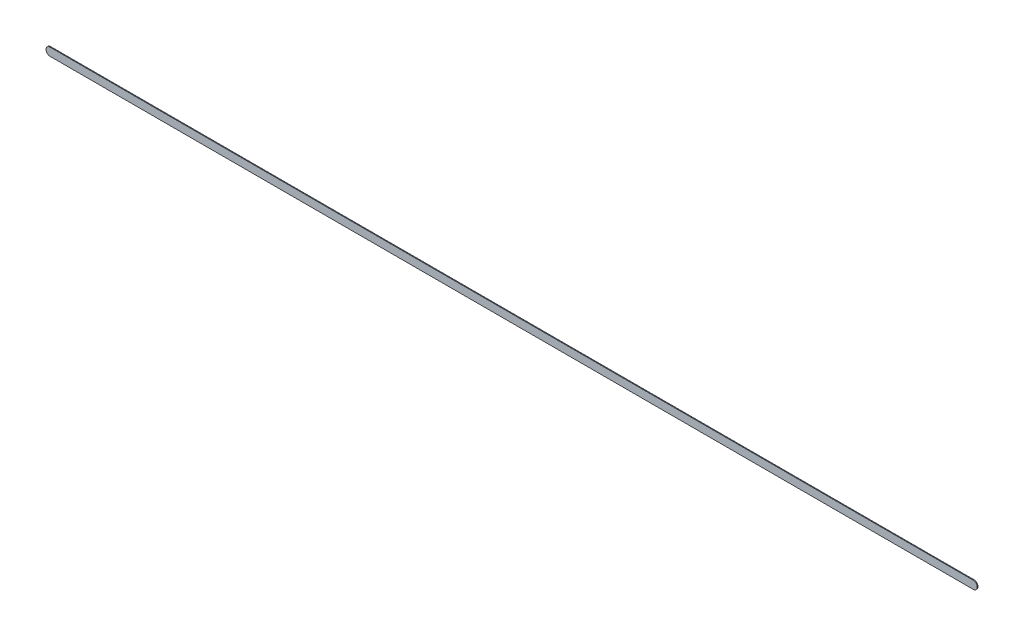
ISO-10303-21;
HEADER;
FILE_DESCRIPTION(('STEP AP214'),'2;1');
FILE_NAME('part.step','',(''),(''),'','','');
FILE_SCHEMA(('AUTOMOTIVE_DESIGN { 1 0 10303 214 1 1 1 1 }'));
ENDSEC;
DATA;
#1=APPLICATION_CONTEXT('core data for automotive mechanical design processes');
#2=APPLICATION_PROTOCOL_DEFINITION('international standard','automotive_design',2000,#1);
#3=PRODUCT_CONTEXT('',#1,'mechanical');
#4=PRODUCT('Part','Part','',(#3));
#5=PRODUCT_RELATED_PRODUCT_CATEGORY('part','',(#4));
#6=PRODUCT_DEFINITION_FORMATION('','',#4);
#7=PRODUCT_DEFINITION_CONTEXT('part definition',#1,'design');
#8=PRODUCT_DEFINITION('design','',#6,#7);
#9=PRODUCT_DEFINITION_SHAPE('','',#8);
#10=(LENGTH_UNIT() NAMED_UNIT(*) SI_UNIT(.MILLI.,.METRE.));
#11=(NAMED_UNIT(*) PLANE_ANGLE_UNIT() SI_UNIT($,.RADIAN.));
#12=(NAMED_UNIT(*) SI_UNIT($,.STERADIAN.) SOLID_ANGLE_UNIT());
#13=UNCERTAINTY_MEASURE_WITH_UNIT(LENGTH_MEASURE(1.E-05),#10,'distance_accuracy_value','');
#14=(GEOMETRIC_REPRESENTATION_CONTEXT(3) GLOBAL_UNCERTAINTY_ASSIGNED_CONTEXT((#13)) GLOBAL_UNIT_ASSIGNED_CONTEXT((#10,
#11,#12)) REPRESENTATION_CONTEXT('',''));
#15=CARTESIAN_POINT('',(0.,0.,0.));
#16=DIRECTION('',(0.,0.,1.));
#17=DIRECTION('',(1.,0.,0.));
#18=AXIS2_PLACEMENT_3D('',#15,#16,#17);
#19=CARTESIAN_POINT('',(32.240499267578,25.374998779297,1.1723000001));
#20=DIRECTION('',(0.,0.,1.));
#21=DIRECTION('',(1.,0.,0.));
#22=AXIS2_PLACEMENT_3D('',#19,#20,#21);
#23=PLANE('',#22);
#24=CARTESIAN_POINT('',(39.587498779297,25.374998779297,1.1723000001));
#25=DIRECTION('',(0.,0.,-1.));
#26=DIRECTION('',(1.,0.,0.));
#27=AXIS2_PLACEMENT_3D('',#24,#25,#26);
#28=CIRCLE('',#27,0.06349975587111);
#29=CARTESIAN_POINT('',(39.587499389648,25.438498535156,1.1723000001));
#30=VERTEX_POINT('',#29);
#31=CARTESIAN_POINT('',(39.650998535168,25.374998779297,1.1723000001));
#32=VERTEX_POINT('',#31);
#33=EDGE_CURVE('E28',#30,#32,#28,.T.);
#34=ORIENTED_EDGE('',*,*,#33,.F.);
#35=DIRECTION('',(-1.,0.,0.));
#36=VECTOR('',#35,1.);
#37=CARTESIAN_POINT('',(24.893498535156,25.438498535156,1.1723000001));
#38=LINE('',#37,#36);
#39=CARTESIAN_POINT('',(24.893499145508,25.438498535156,1.1723000001));
#40=VERTEX_POINT('',#39);
#41=EDGE_CURVE('E81',#30,#40,#38,.T.);
#42=ORIENTED_EDGE('',*,*,#41,.T.);
#43=CARTESIAN_POINT('',(24.893499755859,25.374998779297,1.1723000001));
#44=DIRECTION('',(0.,0.,1.));
#45=DIRECTION('',(1.,0.,0.));
#46=AXIS2_PLACEMENT_3D('',#43,#44,#45);
#47=CIRCLE('',#46,0.06349975587111);
#48=CARTESIAN_POINT('',(24.893499145508,25.311499023438,1.1723000001));
#49=VERTEX_POINT('',#48);
#50=EDGE_CURVE('E112',#40,#49,#47,.T.);
#51=ORIENTED_EDGE('',*,*,#50,.T.);
#52=DIRECTION('',(1.,0.,0.));
#53=VECTOR('',#52,1.);
#54=CARTESIAN_POINT('',(39.5875,25.311499023437,1.1723000001));
#55=LINE('',#54,#53);
#56=CARTESIAN_POINT('',(39.587499389648,25.311499023438,1.1723000001));
#57=VERTEX_POINT('',#56);
#58=EDGE_CURVE('E11',#49,#57,#55,.T.);
#59=ORIENTED_EDGE('',*,*,#58,.T.);
#60=CARTESIAN_POINT('',(39.587498779297,25.374998779297,1.1723000001));
#61=DIRECTION('',(0.,0.,-1.));
#62=DIRECTION('',(1.,0.,0.));
#63=AXIS2_PLACEMENT_3D('',#60,#61,#62);
#64=CIRCLE('',#63,0.06349975587111);
#65=EDGE_CURVE('E108',#32,#57,#64,.T.);
#66=ORIENTED_EDGE('',*,*,#65,.F.);
#67=EDGE_LOOP('',(#34,#42,#51,#59,#66));
#68=FACE_BOUND('',#67,.T.);
#69=ADVANCED_FACE('F17',(#68),#23,.T.);
#70=CARTESIAN_POINT('',(39.5875,25.311499023437,1.1596000001));
#71=DIRECTION('',(0.,1.,0.));
#72=DIRECTION('',(1.,0.,0.));
#73=AXIS2_PLACEMENT_3D('',#70,#71,#72);
#74=PLANE('',#73);
#75=DIRECTION('',(0.,0.,1.));
#76=VECTOR('',#75,1.);
#77=CARTESIAN_POINT('',(24.893498535156,25.311499023438,1.1596000001));
#78=LINE('',#77,#76);
#79=CARTESIAN_POINT('',(24.893499145508,25.311499023438,1.1596000001));
#80=VERTEX_POINT('',#79);
#81=EDGE_CURVE('E116',#80,#49,#78,.T.);
#82=ORIENTED_EDGE('',*,*,#81,.F.);
#83=DIRECTION('',(1.,0.,0.));
#84=VECTOR('',#83,1.);
#85=CARTESIAN_POINT('',(32.240499267578,25.311499023437,1.1596000001));
#86=LINE('',#85,#84);
#87=CARTESIAN_POINT('',(39.587499389648,25.311499023438,1.1596000001));
#88=VERTEX_POINT('',#87);
#89=EDGE_CURVE('E94',#80,#88,#86,.T.);
#90=ORIENTED_EDGE('',*,*,#89,.T.);
#91=DIRECTION('',(0.,0.,-1.));
#92=VECTOR('',#91,1.);
#93=CARTESIAN_POINT('',(39.5875,25.311499023438,1.1596000001));
#94=LINE('',#93,#92);
#95=EDGE_CURVE('E101',#57,#88,#94,.T.);
#96=ORIENTED_EDGE('',*,*,#95,.F.);
#97=ORIENTED_EDGE('',*,*,#58,.F.);
#98=EDGE_LOOP('',(#82,#90,#96,#97));
#99=FACE_BOUND('',#98,.T.);
#100=ADVANCED_FACE('F151',(#99),#74,.F.);
#101=CARTESIAN_POINT('',(39.587498779297,25.374998779297,1.1596000001));
#102=DIRECTION('',(0.,0.,1.));
#103=DIRECTION('',(1.,0.,0.));
#104=AXIS2_PLACEMENT_3D('',#101,#102,#103);
#105=CYLINDRICAL_SURFACE('',#104,0.06349975587111);
#106=DIRECTION('',(0.,0.,1.));
#107=VECTOR('',#106,1.);
#108=CARTESIAN_POINT('',(39.650998535168,25.374998779297,1.1596000001));
#109=LINE('',#108,#107);
#110=CARTESIAN_POINT('',(39.650998535168,25.374998779297,1.1596000001));
#111=VERTEX_POINT('',#110);
#112=EDGE_CURVE('E21',#111,#32,#109,.T.);
#113=ORIENTED_EDGE('',*,*,#112,.F.);
#114=CARTESIAN_POINT('',(39.587498779297,25.374998779297,1.1596000001));
#115=DIRECTION('',(0.,0.,1.));
#116=DIRECTION('',(1.,0.,0.));
#117=AXIS2_PLACEMENT_3D('',#114,#115,#116);
#118=CIRCLE('',#117,0.06349975587111);
#119=CARTESIAN_POINT('',(39.587499389648,25.438498535156,1.1596000001));
#120=VERTEX_POINT('',#119);
#121=EDGE_CURVE('E87',#111,#120,#118,.T.);
#122=ORIENTED_EDGE('',*,*,#121,.T.);
#123=DIRECTION('',(0.,0.,1.));
#124=VECTOR('',#123,1.);
#125=CARTESIAN_POINT('',(39.5875,25.438498535156,1.1596000001));
#126=LINE('',#125,#124);
#127=EDGE_CURVE('E75',#120,#30,#126,.T.);
#128=ORIENTED_EDGE('',*,*,#127,.T.);
#129=ORIENTED_EDGE('',*,*,#33,.T.);
#130=EDGE_LOOP('',(#113,#122,#128,#129));
#131=FACE_BOUND('',#130,.T.);
#132=ADVANCED_FACE('F88',(#131),#105,.T.);
#133=CARTESIAN_POINT('',(24.893498535156,25.438498535156,1.1596000001));
#134=DIRECTION('',(0.,-1.,0.));
#135=DIRECTION('',(0.,0.,-1.));
#136=AXIS2_PLACEMENT_3D('',#133,#134,#135);
#137=PLANE('',#136);
#138=ORIENTED_EDGE('',*,*,#127,.F.);
#139=DIRECTION('',(-1.,0.,0.));
#140=VECTOR('',#139,1.);
#141=CARTESIAN_POINT('',(32.240499267578,25.438498535156,1.1596000001));
#142=LINE('',#141,#140);
#143=CARTESIAN_POINT('',(24.893499145508,25.438498535156,1.1596000001));
#144=VERTEX_POINT('',#143);
#145=EDGE_CURVE('E80',#120,#144,#142,.T.);
#146=ORIENTED_EDGE('',*,*,#145,.T.);
#147=DIRECTION('',(0.,0.,-1.));
#148=VECTOR('',#147,1.);
#149=CARTESIAN_POINT('',(24.893498535156,25.438498535156,1.1596000001));
#150=LINE('',#149,#148);
#151=EDGE_CURVE('E84',#40,#144,#150,.T.);
#152=ORIENTED_EDGE('',*,*,#151,.F.);
#153=ORIENTED_EDGE('',*,*,#41,.F.);
#154=EDGE_LOOP('',(#138,#146,#152,#153));
#155=FACE_BOUND('',#154,.T.);
#156=ADVANCED_FACE('F77',(#155),#137,.F.);
#157=CARTESIAN_POINT('',(24.893499755859,25.374998779297,1.1596000001));
#158=DIRECTION('',(0.,0.,1.));
#159=DIRECTION('',(1.,0.,0.));
#160=AXIS2_PLACEMENT_3D('',#157,#158,#159);
#161=CYLINDRICAL_SURFACE('',#160,0.06349975587111);
#162=CARTESIAN_POINT('',(24.893499755859,25.374998779297,1.1596000001));
#163=DIRECTION('',(0.,0.,1.));
#164=DIRECTION('',(1.,0.,0.));
#165=AXIS2_PLACEMENT_3D('',#162,#163,#164);
#166=CIRCLE('',#165,0.06349975587111);
#167=EDGE_CURVE('E99',#144,#80,#166,.T.);
#168=ORIENTED_EDGE('',*,*,#167,.T.);
#169=ORIENTED_EDGE('',*,*,#81,.T.);
#170=ORIENTED_EDGE('',*,*,#50,.F.);
#171=ORIENTED_EDGE('',*,*,#151,.T.);
#172=EDGE_LOOP('',(#168,#169,#170,#171));
#173=FACE_BOUND('',#172,.T.);
#174=ADVANCED_FACE('F123',(#173),#161,.T.);
#175=CARTESIAN_POINT('',(32.240499267578,25.374998779297,1.1596000001));
#176=DIRECTION('',(0.,0.,1.));
#177=DIRECTION('',(1.,0.,0.));
#178=AXIS2_PLACEMENT_3D('',#175,#176,#177);
#179=PLANE('',#178);
#180=ORIENTED_EDGE('',*,*,#145,.F.);
#181=ORIENTED_EDGE('',*,*,#121,.F.);
#182=CARTESIAN_POINT('',(39.587498779297,25.374998779297,1.1596000001));
#183=DIRECTION('',(0.,0.,1.));
#184=DIRECTION('',(1.,0.,0.));
#185=AXIS2_PLACEMENT_3D('',#182,#183,#184);
#186=CIRCLE('',#185,0.06349975587111);
#187=EDGE_CURVE('E138',#88,#111,#186,.T.);
#188=ORIENTED_EDGE('',*,*,#187,.F.);
#189=ORIENTED_EDGE('',*,*,#89,.F.);
#190=ORIENTED_EDGE('',*,*,#167,.F.);
#191=EDGE_LOOP('',(#180,#181,#188,#189,#190));
#192=FACE_BOUND('',#191,.T.);
#193=ADVANCED_FACE('F19',(#192),#179,.F.);
#194=CARTESIAN_POINT('',(39.587498779297,25.374998779297,1.1596000001));
#195=DIRECTION('',(0.,0.,1.));
#196=DIRECTION('',(1.,0.,0.));
#197=AXIS2_PLACEMENT_3D('',#194,#195,#196);
#198=CYLINDRICAL_SURFACE('',#197,0.06349975587111);
#199=ORIENTED_EDGE('',*,*,#187,.T.);
#200=ORIENTED_EDGE('',*,*,#112,.T.);
#201=ORIENTED_EDGE('',*,*,#65,.T.);
#202=ORIENTED_EDGE('',*,*,#95,.T.);
#203=EDGE_LOOP('',(#199,#200,#201,#202));
#204=FACE_BOUND('',#203,.T.);
#205=ADVANCED_FACE('F149',(#204),#198,.T.);
#206=CLOSED_SHELL('',(#69,#100,#132,#156,#174,#193,#205));
#207=MANIFOLD_SOLID_BREP('B1',#206);
#208=ADVANCED_BREP_SHAPE_REPRESENTATION('',(#18,#207),#14);
#209=SHAPE_DEFINITION_REPRESENTATION(#9,#208);
ENDSEC;
END-ISO-10303-21;
